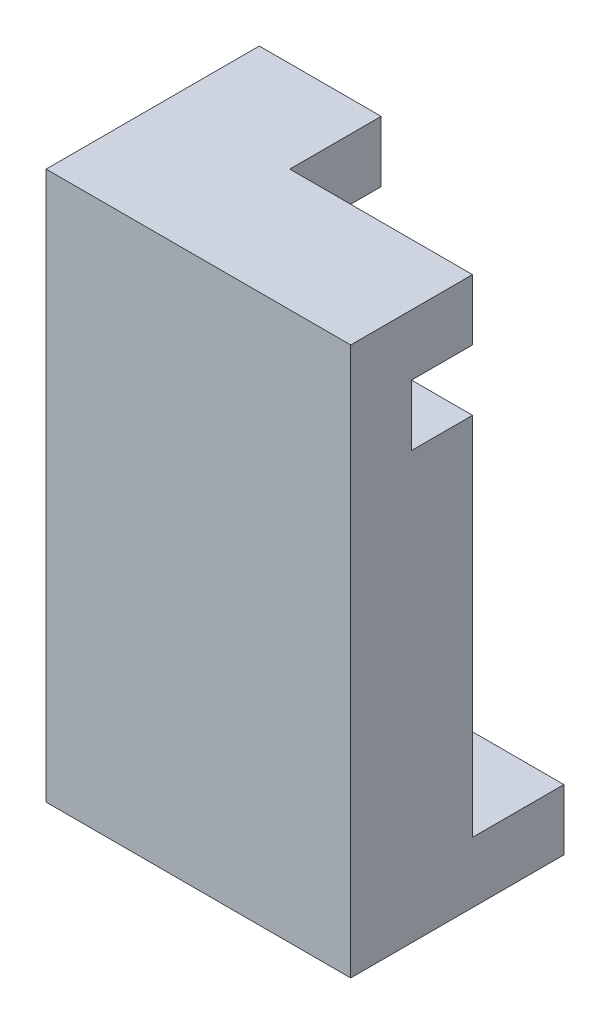
ISO-10303-21;
HEADER;
FILE_DESCRIPTION(('STEP AP214'),'2;1');
FILE_NAME('part.step','',(''),(''),'','','');
FILE_SCHEMA(('AUTOMOTIVE_DESIGN { 1 0 10303 214 1 1 1 1 }'));
ENDSEC;
DATA;
#1=APPLICATION_CONTEXT('core data for automotive mechanical design processes');
#2=APPLICATION_PROTOCOL_DEFINITION('international standard','automotive_design',2000,#1);
#3=PRODUCT_CONTEXT('',#1,'mechanical');
#4=PRODUCT('Part','Part','',(#3));
#5=PRODUCT_RELATED_PRODUCT_CATEGORY('part','',(#4));
#6=PRODUCT_DEFINITION_FORMATION('','',#4);
#7=PRODUCT_DEFINITION_CONTEXT('part definition',#1,'design');
#8=PRODUCT_DEFINITION('design','',#6,#7);
#9=PRODUCT_DEFINITION_SHAPE('','',#8);
#10=(LENGTH_UNIT() NAMED_UNIT(*) SI_UNIT(.MILLI.,.METRE.));
#11=(NAMED_UNIT(*) PLANE_ANGLE_UNIT() SI_UNIT($,.RADIAN.));
#12=(NAMED_UNIT(*) SI_UNIT($,.STERADIAN.) SOLID_ANGLE_UNIT());
#13=UNCERTAINTY_MEASURE_WITH_UNIT(LENGTH_MEASURE(1.E-05),#10,'distance_accuracy_value','');
#14=(GEOMETRIC_REPRESENTATION_CONTEXT(3) GLOBAL_UNCERTAINTY_ASSIGNED_CONTEXT((#13)) GLOBAL_UNIT_ASSIGNED_CONTEXT((#10,
#11,#12)) REPRESENTATION_CONTEXT('',''));
#15=CARTESIAN_POINT('',(0.,0.,0.));
#16=DIRECTION('',(0.,0.,1.));
#17=DIRECTION('',(1.,0.,0.));
#18=AXIS2_PLACEMENT_3D('',#15,#16,#17);
#19=CARTESIAN_POINT('',(25.,40.,-10.));
#20=DIRECTION('',(0.,0.,1.));
#21=DIRECTION('',(1.,0.,0.));
#22=AXIS2_PLACEMENT_3D('',#19,#20,#21);
#23=PLANE('',#22);
#24=DIRECTION('',(0.,-1.,0.));
#25=VECTOR('',#24,1.);
#26=CARTESIAN_POINT('',(10.,40.,-10.));
#27=LINE('',#26,#25);
#28=CARTESIAN_POINT('',(10.,30.,-10.));
#29=VERTEX_POINT('',#28);
#30=CARTESIAN_POINT('',(10.,0.,-10.));
#31=VERTEX_POINT('',#30);
#32=EDGE_CURVE('E75',#29,#31,#27,.T.);
#33=ORIENTED_EDGE('',*,*,#32,.F.);
#34=DIRECTION('',(1.,0.,0.));
#35=VECTOR('',#34,1.);
#36=CARTESIAN_POINT('',(25.,30.,-10.));
#37=LINE('',#36,#35);
#38=CARTESIAN_POINT('',(25.,30.,-10.));
#39=VERTEX_POINT('',#38);
#40=EDGE_CURVE('E163',#29,#39,#37,.T.);
#41=ORIENTED_EDGE('',*,*,#40,.T.);
#42=DIRECTION('',(0.,-1.,0.));
#43=VECTOR('',#42,1.);
#44=CARTESIAN_POINT('',(25.,40.,-10.));
#45=LINE('',#44,#43);
#46=CARTESIAN_POINT('',(25.,0.,-10.));
#47=VERTEX_POINT('',#46);
#48=EDGE_CURVE('E140',#39,#47,#45,.T.);
#49=ORIENTED_EDGE('',*,*,#48,.T.);
#50=DIRECTION('',(-1.,0.,0.));
#51=VECTOR('',#50,1.);
#52=CARTESIAN_POINT('',(25.,0.,-10.));
#53=LINE('',#52,#51);
#54=EDGE_CURVE('E129',#47,#31,#53,.T.);
#55=ORIENTED_EDGE('',*,*,#54,.T.);
#56=EDGE_LOOP('',(#33,#41,#49,#55));
#57=FACE_BOUND('',#56,.T.);
#58=ADVANCED_FACE('F38',(#57),#23,.F.);
#59=CARTESIAN_POINT('',(10.,40.,-10.));
#60=DIRECTION('',(-1.,0.,0.));
#61=DIRECTION('',(0.,0.,1.));
#62=AXIS2_PLACEMENT_3D('',#59,#60,#61);
#63=PLANE('',#62);
#64=DIRECTION('',(0.,0.,-1.));
#65=VECTOR('',#64,1.);
#66=CARTESIAN_POINT('',(10.,0.,-10.));
#67=LINE('',#66,#65);
#68=CARTESIAN_POINT('',(10.,0.,-17.5));
#69=VERTEX_POINT('',#68);
#70=EDGE_CURVE('E133',#31,#69,#67,.T.);
#71=ORIENTED_EDGE('',*,*,#70,.T.);
#72=DIRECTION('',(0.,1.,0.));
#73=VECTOR('',#72,1.);
#74=CARTESIAN_POINT('',(10.,40.,-17.5));
#75=LINE('',#74,#73);
#76=CARTESIAN_POINT('',(10.,30.,-17.5));
#77=VERTEX_POINT('',#76);
#78=EDGE_CURVE('E216',#69,#77,#75,.T.);
#79=ORIENTED_EDGE('',*,*,#78,.T.);
#80=DIRECTION('',(0.,0.,1.));
#81=VECTOR('',#80,1.);
#82=CARTESIAN_POINT('',(10.,30.,-10.));
#83=LINE('',#82,#81);
#84=EDGE_CURVE('E170',#77,#29,#83,.T.);
#85=ORIENTED_EDGE('',*,*,#84,.T.);
#86=ORIENTED_EDGE('',*,*,#32,.T.);
#87=EDGE_LOOP('',(#71,#79,#85,#86));
#88=FACE_BOUND('',#87,.T.);
#89=ADVANCED_FACE('F307',(#88),#63,.F.);
#90=CARTESIAN_POINT('',(0.,40.,-25.));
#91=DIRECTION('',(1.,0.,0.));
#92=DIRECTION('',(0.,0.,-1.));
#93=AXIS2_PLACEMENT_3D('',#90,#91,#92);
#94=PLANE('',#93);
#95=DIRECTION('',(0.,0.,1.));
#96=VECTOR('',#95,1.);
#97=CARTESIAN_POINT('',(0.,40.,-25.));
#98=LINE('',#97,#96);
#99=CARTESIAN_POINT('',(0.,40.,-17.5));
#100=VERTEX_POINT('',#99);
#101=CARTESIAN_POINT('',(0.,40.,0.));
#102=VERTEX_POINT('',#101);
#103=EDGE_CURVE('E102',#100,#102,#98,.T.);
#104=ORIENTED_EDGE('',*,*,#103,.F.);
#105=DIRECTION('',(0.,-1.,0.));
#106=VECTOR('',#105,1.);
#107=CARTESIAN_POINT('',(0.,-5.,-17.5));
#108=LINE('',#107,#106);
#109=CARTESIAN_POINT('',(0.,-5.,-17.5));
#110=VERTEX_POINT('',#109);
#111=EDGE_CURVE('E157',#100,#110,#108,.T.);
#112=ORIENTED_EDGE('',*,*,#111,.T.);
#113=DIRECTION('',(0.,0.,-1.));
#114=VECTOR('',#113,1.);
#115=CARTESIAN_POINT('',(0.,-5.,0.));
#116=LINE('',#115,#114);
#117=CARTESIAN_POINT('',(0.,-5.,0.));
#118=VERTEX_POINT('',#117);
#119=EDGE_CURVE('E151',#118,#110,#116,.T.);
#120=ORIENTED_EDGE('',*,*,#119,.F.);
#121=DIRECTION('',(0.,-1.,0.));
#122=VECTOR('',#121,1.);
#123=CARTESIAN_POINT('',(0.,40.,0.));
#124=LINE('',#123,#122);
#125=EDGE_CURVE('E47',#102,#118,#124,.T.);
#126=ORIENTED_EDGE('',*,*,#125,.F.);
#127=EDGE_LOOP('',(#104,#112,#120,#126));
#128=FACE_BOUND('',#127,.T.);
#129=ADVANCED_FACE('F40',(#128),#94,.F.);
#130=CARTESIAN_POINT('',(0.,40.,0.));
#131=DIRECTION('',(0.,0.,-1.));
#132=DIRECTION('',(-1.,0.,0.));
#133=AXIS2_PLACEMENT_3D('',#130,#131,#132);
#134=PLANE('',#133);
#135=ORIENTED_EDGE('',*,*,#125,.T.);
#136=DIRECTION('',(-1.,0.,0.));
#137=VECTOR('',#136,1.);
#138=CARTESIAN_POINT('',(0.,-5.,0.));
#139=LINE('',#138,#137);
#140=CARTESIAN_POINT('',(25.,-5.,0.));
#141=VERTEX_POINT('',#140);
#142=EDGE_CURVE('E112',#141,#118,#139,.T.);
#143=ORIENTED_EDGE('',*,*,#142,.F.);
#144=DIRECTION('',(0.,-1.,0.));
#145=VECTOR('',#144,1.);
#146=CARTESIAN_POINT('',(25.,40.,0.));
#147=LINE('',#146,#145);
#148=CARTESIAN_POINT('',(25.,40.,0.));
#149=VERTEX_POINT('',#148);
#150=EDGE_CURVE('E109',#149,#141,#147,.T.);
#151=ORIENTED_EDGE('',*,*,#150,.F.);
#152=DIRECTION('',(1.,0.,0.));
#153=VECTOR('',#152,1.);
#154=CARTESIAN_POINT('',(0.,40.,0.));
#155=LINE('',#154,#153);
#156=EDGE_CURVE('E94',#102,#149,#155,.T.);
#157=ORIENTED_EDGE('',*,*,#156,.F.);
#158=EDGE_LOOP('',(#135,#143,#151,#157));
#159=FACE_BOUND('',#158,.T.);
#160=ADVANCED_FACE('F110',(#159),#134,.F.);
#161=CARTESIAN_POINT('',(25.,40.,0.));
#162=DIRECTION('',(-1.,0.,0.));
#163=DIRECTION('',(0.,0.,1.));
#164=AXIS2_PLACEMENT_3D('',#161,#162,#163);
#165=PLANE('',#164);
#166=DIRECTION('',(0.,0.,1.));
#167=VECTOR('',#166,1.);
#168=CARTESIAN_POINT('',(25.,-5.,0.));
#169=LINE('',#168,#167);
#170=CARTESIAN_POINT('',(25.,-5.,-17.5));
#171=VERTEX_POINT('',#170);
#172=EDGE_CURVE('E152',#171,#141,#169,.T.);
#173=ORIENTED_EDGE('',*,*,#172,.F.);
#174=DIRECTION('',(0.,-1.,0.));
#175=VECTOR('',#174,1.);
#176=CARTESIAN_POINT('',(25.,-5.,-17.5));
#177=LINE('',#176,#175);
#178=CARTESIAN_POINT('',(25.,0.,-17.5));
#179=VERTEX_POINT('',#178);
#180=EDGE_CURVE('E239',#179,#171,#177,.T.);
#181=ORIENTED_EDGE('',*,*,#180,.F.);
#182=DIRECTION('',(0.,0.,1.));
#183=VECTOR('',#182,1.);
#184=CARTESIAN_POINT('',(25.,0.,0.));
#185=LINE('',#184,#183);
#186=EDGE_CURVE('E86',#179,#47,#185,.T.);
#187=ORIENTED_EDGE('',*,*,#186,.T.);
#188=ORIENTED_EDGE('',*,*,#48,.F.);
#189=DIRECTION('',(0.,0.,-1.));
#190=VECTOR('',#189,1.);
#191=CARTESIAN_POINT('',(25.,30.,-5.));
#192=LINE('',#191,#190);
#193=CARTESIAN_POINT('',(25.,30.,-5.));
#194=VERTEX_POINT('',#193);
#195=EDGE_CURVE('E190',#194,#39,#192,.T.);
#196=ORIENTED_EDGE('',*,*,#195,.F.);
#197=DIRECTION('',(0.,-1.,0.));
#198=VECTOR('',#197,1.);
#199=CARTESIAN_POINT('',(25.,30.,-5.));
#200=LINE('',#199,#198);
#201=CARTESIAN_POINT('',(25.,35.,-5.));
#202=VERTEX_POINT('',#201);
#203=EDGE_CURVE('E200',#202,#194,#200,.T.);
#204=ORIENTED_EDGE('',*,*,#203,.F.);
#205=DIRECTION('',(0.,0.,-1.));
#206=VECTOR('',#205,1.);
#207=CARTESIAN_POINT('',(25.,35.,-5.));
#208=LINE('',#207,#206);
#209=CARTESIAN_POINT('',(25.,35.,-10.));
#210=VERTEX_POINT('',#209);
#211=EDGE_CURVE('E186',#202,#210,#208,.T.);
#212=ORIENTED_EDGE('',*,*,#211,.T.);
#213=CARTESIAN_POINT('',(25.,40.,-10.));
#214=VERTEX_POINT('',#213);
#215=EDGE_CURVE('E115',#214,#210,#45,.T.);
#216=ORIENTED_EDGE('',*,*,#215,.F.);
#217=DIRECTION('',(0.,0.,-1.));
#218=VECTOR('',#217,1.);
#219=CARTESIAN_POINT('',(25.,40.,0.));
#220=LINE('',#219,#218);
#221=EDGE_CURVE('E99',#149,#214,#220,.T.);
#222=ORIENTED_EDGE('',*,*,#221,.F.);
#223=ORIENTED_EDGE('',*,*,#150,.T.);
#224=EDGE_LOOP('',(#173,#181,#187,#188,#196,#204,#212,#216,#222,#223));
#225=FACE_BOUND('',#224,.T.);
#226=ADVANCED_FACE('F117',(#225),#165,.F.);
#227=ORIENTED_EDGE('',*,*,#215,.T.);
#228=DIRECTION('',(-1.,0.,0.));
#229=VECTOR('',#228,1.);
#230=CARTESIAN_POINT('',(25.,35.,-10.));
#231=LINE('',#230,#229);
#232=CARTESIAN_POINT('',(10.,35.,-10.));
#233=VERTEX_POINT('',#232);
#234=EDGE_CURVE('E173',#210,#233,#231,.T.);
#235=ORIENTED_EDGE('',*,*,#234,.T.);
#236=CARTESIAN_POINT('',(10.,40.,-10.));
#237=VERTEX_POINT('',#236);
#238=EDGE_CURVE('E136',#237,#233,#27,.T.);
#239=ORIENTED_EDGE('',*,*,#238,.F.);
#240=DIRECTION('',(-1.,0.,0.));
#241=VECTOR('',#240,1.);
#242=CARTESIAN_POINT('',(25.,40.,-10.));
#243=LINE('',#242,#241);
#244=EDGE_CURVE('E62',#214,#237,#243,.T.);
#245=ORIENTED_EDGE('',*,*,#244,.F.);
#246=EDGE_LOOP('',(#227,#235,#239,#245));
#247=FACE_BOUND('',#246,.T.);
#248=ADVANCED_FACE('F316',(#247),#23,.F.);
#249=DIRECTION('',(0.,0.,-1.));
#250=VECTOR('',#249,1.);
#251=CARTESIAN_POINT('',(10.,35.,-10.));
#252=LINE('',#251,#250);
#253=CARTESIAN_POINT('',(10.,35.,-17.5));
#254=VERTEX_POINT('',#253);
#255=EDGE_CURVE('E177',#233,#254,#252,.T.);
#256=ORIENTED_EDGE('',*,*,#255,.T.);
#257=DIRECTION('',(0.,1.,0.));
#258=VECTOR('',#257,1.);
#259=CARTESIAN_POINT('',(10.,40.,-17.5));
#260=LINE('',#259,#258);
#261=CARTESIAN_POINT('',(10.,40.,-17.5));
#262=VERTEX_POINT('',#261);
#263=EDGE_CURVE('E220',#254,#262,#260,.T.);
#264=ORIENTED_EDGE('',*,*,#263,.T.);
#265=DIRECTION('',(0.,0.,-1.));
#266=VECTOR('',#265,1.);
#267=CARTESIAN_POINT('',(10.,40.,-10.));
#268=LINE('',#267,#266);
#269=EDGE_CURVE('E123',#237,#262,#268,.T.);
#270=ORIENTED_EDGE('',*,*,#269,.F.);
#271=ORIENTED_EDGE('',*,*,#238,.T.);
#272=EDGE_LOOP('',(#256,#264,#270,#271));
#273=FACE_BOUND('',#272,.T.);
#274=ADVANCED_FACE('F298',(#273),#63,.F.);
#275=CARTESIAN_POINT('',(0.,40.,0.));
#276=DIRECTION('',(0.,1.,0.));
#277=DIRECTION('',(0.,0.,1.));
#278=AXIS2_PLACEMENT_3D('',#275,#276,#277);
#279=PLANE('',#278);
#280=DIRECTION('',(1.,0.,0.));
#281=VECTOR('',#280,1.);
#282=CARTESIAN_POINT('',(0.,40.,-17.5));
#283=LINE('',#282,#281);
#284=EDGE_CURVE('E231',#100,#262,#283,.T.);
#285=ORIENTED_EDGE('',*,*,#284,.F.);
#286=ORIENTED_EDGE('',*,*,#103,.T.);
#287=ORIENTED_EDGE('',*,*,#156,.T.);
#288=ORIENTED_EDGE('',*,*,#221,.T.);
#289=ORIENTED_EDGE('',*,*,#244,.T.);
#290=ORIENTED_EDGE('',*,*,#269,.T.);
#291=EDGE_LOOP('',(#285,#286,#287,#288,#289,#290));
#292=FACE_BOUND('',#291,.T.);
#293=ADVANCED_FACE('F97',(#292),#279,.T.);
#294=CARTESIAN_POINT('',(0.,-5.,0.));
#295=DIRECTION('',(0.,-1.,0.));
#296=DIRECTION('',(0.,0.,-1.));
#297=AXIS2_PLACEMENT_3D('',#294,#295,#296);
#298=PLANE('',#297);
#299=DIRECTION('',(1.,0.,0.));
#300=VECTOR('',#299,1.);
#301=CARTESIAN_POINT('',(0.,-5.,-17.5));
#302=LINE('',#301,#300);
#303=EDGE_CURVE('E230',#110,#171,#302,.T.);
#304=ORIENTED_EDGE('',*,*,#303,.T.);
#305=ORIENTED_EDGE('',*,*,#172,.T.);
#306=ORIENTED_EDGE('',*,*,#142,.T.);
#307=ORIENTED_EDGE('',*,*,#119,.T.);
#308=EDGE_LOOP('',(#304,#305,#306,#307));
#309=FACE_BOUND('',#308,.T.);
#310=ADVANCED_FACE('F149',(#309),#298,.T.);
#311=CARTESIAN_POINT('',(0.,0.,0.));
#312=DIRECTION('',(0.,-1.,0.));
#313=DIRECTION('',(0.,0.,-1.));
#314=AXIS2_PLACEMENT_3D('',#311,#312,#313);
#315=PLANE('',#314);
#316=ORIENTED_EDGE('',*,*,#186,.F.);
#317=DIRECTION('',(-1.,0.,0.));
#318=VECTOR('',#317,1.);
#319=CARTESIAN_POINT('',(0.,0.,-17.5));
#320=LINE('',#319,#318);
#321=EDGE_CURVE('E212',#179,#69,#320,.T.);
#322=ORIENTED_EDGE('',*,*,#321,.T.);
#323=ORIENTED_EDGE('',*,*,#70,.F.);
#324=ORIENTED_EDGE('',*,*,#54,.F.);
#325=EDGE_LOOP('',(#316,#322,#323,#324));
#326=FACE_BOUND('',#325,.T.);
#327=ADVANCED_FACE('F254',(#326),#315,.F.);
#328=CARTESIAN_POINT('',(5.,30.,-5.));
#329=DIRECTION('',(0.,-1.,0.));
#330=DIRECTION('',(1.,0.,0.));
#331=AXIS2_PLACEMENT_3D('',#328,#329,#330);
#332=PLANE('',#331);
#333=ORIENTED_EDGE('',*,*,#84,.F.);
#334=DIRECTION('',(-1.,0.,0.));
#335=VECTOR('',#334,1.);
#336=CARTESIAN_POINT('',(5.,30.,-17.5));
#337=LINE('',#336,#335);
#338=CARTESIAN_POINT('',(5.,30.,-17.5));
#339=VERTEX_POINT('',#338);
#340=EDGE_CURVE('E224',#77,#339,#337,.T.);
#341=ORIENTED_EDGE('',*,*,#340,.T.);
#342=DIRECTION('',(0.,0.,-1.));
#343=VECTOR('',#342,1.);
#344=CARTESIAN_POINT('',(5.,30.,-5.));
#345=LINE('',#344,#343);
#346=CARTESIAN_POINT('',(5.,30.,-5.));
#347=VERTEX_POINT('',#346);
#348=EDGE_CURVE('E181',#347,#339,#345,.T.);
#349=ORIENTED_EDGE('',*,*,#348,.F.);
#350=DIRECTION('',(-1.,0.,0.));
#351=VECTOR('',#350,1.);
#352=CARTESIAN_POINT('',(5.,30.,-5.));
#353=LINE('',#352,#351);
#354=EDGE_CURVE('E187',#194,#347,#353,.T.);
#355=ORIENTED_EDGE('',*,*,#354,.F.);
#356=ORIENTED_EDGE('',*,*,#195,.T.);
#357=ORIENTED_EDGE('',*,*,#40,.F.);
#358=EDGE_LOOP('',(#333,#341,#349,#355,#356,#357));
#359=FACE_BOUND('',#358,.T.);
#360=ADVANCED_FACE('F306',(#359),#332,.F.);
#361=CARTESIAN_POINT('',(5.,35.,-5.));
#362=DIRECTION('',(0.,1.,0.));
#363=DIRECTION('',(0.,0.,1.));
#364=AXIS2_PLACEMENT_3D('',#361,#362,#363);
#365=PLANE('',#364);
#366=DIRECTION('',(0.,0.,-1.));
#367=VECTOR('',#366,1.);
#368=CARTESIAN_POINT('',(5.,35.,-5.));
#369=LINE('',#368,#367);
#370=CARTESIAN_POINT('',(5.,35.,-5.));
#371=VERTEX_POINT('',#370);
#372=CARTESIAN_POINT('',(5.,35.,-17.5));
#373=VERTEX_POINT('',#372);
#374=EDGE_CURVE('E182',#371,#373,#369,.T.);
#375=ORIENTED_EDGE('',*,*,#374,.T.);
#376=DIRECTION('',(1.,0.,0.));
#377=VECTOR('',#376,1.);
#378=CARTESIAN_POINT('',(5.,35.,-17.5));
#379=LINE('',#378,#377);
#380=EDGE_CURVE('E54',#373,#254,#379,.T.);
#381=ORIENTED_EDGE('',*,*,#380,.T.);
#382=ORIENTED_EDGE('',*,*,#255,.F.);
#383=ORIENTED_EDGE('',*,*,#234,.F.);
#384=ORIENTED_EDGE('',*,*,#211,.F.);
#385=DIRECTION('',(1.,0.,0.));
#386=VECTOR('',#385,1.);
#387=CARTESIAN_POINT('',(5.,35.,-5.));
#388=LINE('',#387,#386);
#389=EDGE_CURVE('E204',#371,#202,#388,.T.);
#390=ORIENTED_EDGE('',*,*,#389,.F.);
#391=EDGE_LOOP('',(#375,#381,#382,#383,#384,#390));
#392=FACE_BOUND('',#391,.T.);
#393=ADVANCED_FACE('F300',(#392),#365,.F.);
#394=CARTESIAN_POINT('',(5.,30.,-5.));
#395=DIRECTION('',(-1.,0.,0.));
#396=DIRECTION('',(0.,0.,1.));
#397=AXIS2_PLACEMENT_3D('',#394,#395,#396);
#398=PLANE('',#397);
#399=ORIENTED_EDGE('',*,*,#348,.T.);
#400=DIRECTION('',(0.,1.,0.));
#401=VECTOR('',#400,1.);
#402=CARTESIAN_POINT('',(5.,30.,-17.5));
#403=LINE('',#402,#401);
#404=EDGE_CURVE('E11',#339,#373,#403,.T.);
#405=ORIENTED_EDGE('',*,*,#404,.T.);
#406=ORIENTED_EDGE('',*,*,#374,.F.);
#407=DIRECTION('',(0.,1.,0.));
#408=VECTOR('',#407,1.);
#409=CARTESIAN_POINT('',(5.,30.,-5.));
#410=LINE('',#409,#408);
#411=EDGE_CURVE('E208',#347,#371,#410,.T.);
#412=ORIENTED_EDGE('',*,*,#411,.F.);
#413=EDGE_LOOP('',(#399,#405,#406,#412));
#414=FACE_BOUND('',#413,.T.);
#415=ADVANCED_FACE('F304',(#414),#398,.F.);
#416=CARTESIAN_POINT('',(0.,0.,-5.));
#417=DIRECTION('',(0.,0.,-1.));
#418=DIRECTION('',(-1.,0.,0.));
#419=AXIS2_PLACEMENT_3D('',#416,#417,#418);
#420=PLANE('',#419);
#421=ORIENTED_EDGE('',*,*,#411,.T.);
#422=ORIENTED_EDGE('',*,*,#389,.T.);
#423=ORIENTED_EDGE('',*,*,#203,.T.);
#424=ORIENTED_EDGE('',*,*,#354,.T.);
#425=EDGE_LOOP('',(#421,#422,#423,#424));
#426=FACE_BOUND('',#425,.T.);
#427=ADVANCED_FACE('F394',(#426),#420,.T.);
#428=CARTESIAN_POINT('',(0.,-5.,-17.5));
#429=DIRECTION('',(0.,0.,1.));
#430=DIRECTION('',(1.,0.,0.));
#431=AXIS2_PLACEMENT_3D('',#428,#429,#430);
#432=PLANE('',#431);
#433=ORIENTED_EDGE('',*,*,#180,.T.);
#434=ORIENTED_EDGE('',*,*,#303,.F.);
#435=ORIENTED_EDGE('',*,*,#111,.F.);
#436=ORIENTED_EDGE('',*,*,#284,.T.);
#437=ORIENTED_EDGE('',*,*,#263,.F.);
#438=ORIENTED_EDGE('',*,*,#380,.F.);
#439=ORIENTED_EDGE('',*,*,#404,.F.);
#440=ORIENTED_EDGE('',*,*,#340,.F.);
#441=ORIENTED_EDGE('',*,*,#78,.F.);
#442=ORIENTED_EDGE('',*,*,#321,.F.);
#443=EDGE_LOOP('',(#433,#434,#435,#436,#437,#438,#439,#440,#441,#442));
#444=FACE_BOUND('',#443,.T.);
#445=ADVANCED_FACE('F245',(#444),#432,.F.);
#446=CLOSED_SHELL('',(#58,#89,#129,#160,#226,#248,#274,#293,#310,#327,#360,#393,#415,#427,#445));
#447=MANIFOLD_SOLID_BREP('B2',#446);
#448=ADVANCED_BREP_SHAPE_REPRESENTATION('',(#18,#447),#14);
#449=SHAPE_DEFINITION_REPRESENTATION(#9,#448);
ENDSEC;
END-ISO-10303-21;
